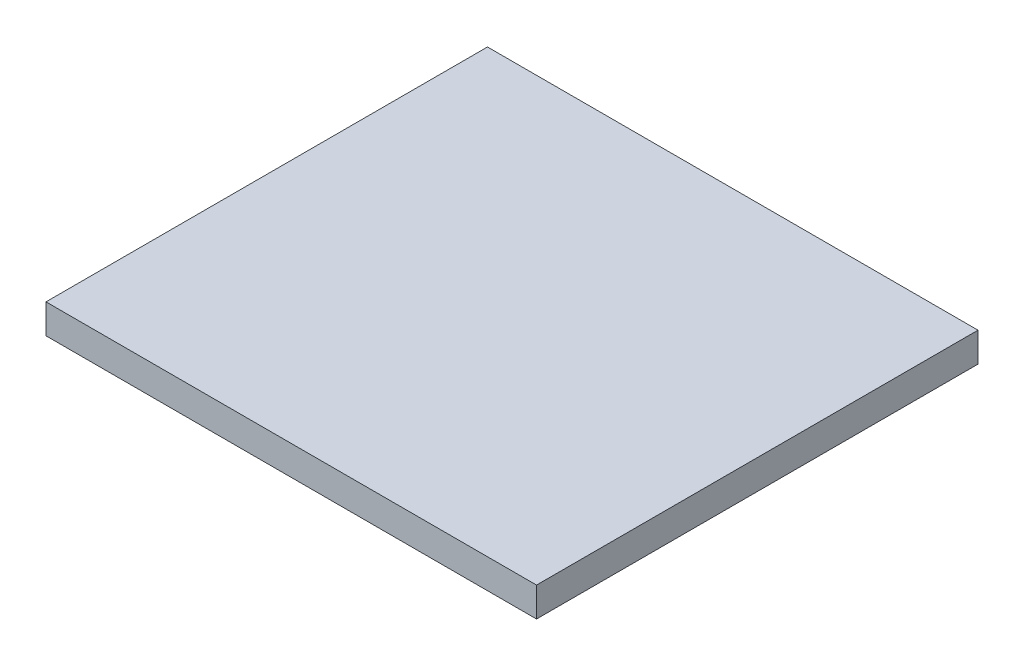
ISO-10303-21;
HEADER;
FILE_DESCRIPTION(('STEP AP214'),'2;1');
FILE_NAME('part.step','',(''),(''),'','','');
FILE_SCHEMA(('AUTOMOTIVE_DESIGN { 1 0 10303 214 1 1 1 1 }'));
ENDSEC;
DATA;
#1=APPLICATION_CONTEXT('core data for automotive mechanical design processes');
#2=APPLICATION_PROTOCOL_DEFINITION('international standard','automotive_design',2000,#1);
#3=PRODUCT_CONTEXT('',#1,'mechanical');
#4=PRODUCT('Part','Part','',(#3));
#5=PRODUCT_RELATED_PRODUCT_CATEGORY('part','',(#4));
#6=PRODUCT_DEFINITION_FORMATION('','',#4);
#7=PRODUCT_DEFINITION_CONTEXT('part definition',#1,'design');
#8=PRODUCT_DEFINITION('design','',#6,#7);
#9=PRODUCT_DEFINITION_SHAPE('','',#8);
#10=(LENGTH_UNIT() NAMED_UNIT(*) SI_UNIT(.MILLI.,.METRE.));
#11=(NAMED_UNIT(*) PLANE_ANGLE_UNIT() SI_UNIT($,.RADIAN.));
#12=(NAMED_UNIT(*) SI_UNIT($,.STERADIAN.) SOLID_ANGLE_UNIT());
#13=UNCERTAINTY_MEASURE_WITH_UNIT(LENGTH_MEASURE(1.E-05),#10,'distance_accuracy_value','');
#14=(GEOMETRIC_REPRESENTATION_CONTEXT(3) GLOBAL_UNCERTAINTY_ASSIGNED_CONTEXT((#13)) GLOBAL_UNIT_ASSIGNED_CONTEXT((#10,
#11,#12)) REPRESENTATION_CONTEXT('',''));
#15=CARTESIAN_POINT('',(0.,0.,0.));
#16=DIRECTION('',(0.,0.,1.));
#17=DIRECTION('',(1.,0.,0.));
#18=AXIS2_PLACEMENT_3D('',#15,#16,#17);
#19=CARTESIAN_POINT('',(0.,300.,0.));
#20=DIRECTION('',(1.,0.,0.));
#21=DIRECTION('',(0.,0.,-1.));
#22=AXIS2_PLACEMENT_3D('',#19,#20,#21);
#23=PLANE('',#22);
#24=DIRECTION('',(0.,0.,1.));
#25=VECTOR('',#24,1.);
#26=CARTESIAN_POINT('',(0.,0.,0.));
#27=LINE('',#26,#25);
#28=CARTESIAN_POINT('',(0.,0.,-4500.));
#29=VERTEX_POINT('',#28);
#30=CARTESIAN_POINT('',(0.,0.,0.));
#31=VERTEX_POINT('',#30);
#32=EDGE_CURVE('E113',#29,#31,#27,.T.);
#33=ORIENTED_EDGE('',*,*,#32,.T.);
#34=DIRECTION('',(0.,-1.,0.));
#35=VECTOR('',#34,1.);
#36=CARTESIAN_POINT('',(0.,300.,0.));
#37=LINE('',#36,#35);
#38=CARTESIAN_POINT('',(0.,300.,0.));
#39=VERTEX_POINT('',#38);
#40=EDGE_CURVE('E11',#39,#31,#37,.T.);
#41=ORIENTED_EDGE('',*,*,#40,.F.);
#42=DIRECTION('',(0.,0.,1.));
#43=VECTOR('',#42,1.);
#44=CARTESIAN_POINT('',(0.,300.,0.));
#45=LINE('',#44,#43);
#46=CARTESIAN_POINT('',(0.,300.,-4500.));
#47=VERTEX_POINT('',#46);
#48=EDGE_CURVE('E97',#47,#39,#45,.T.);
#49=ORIENTED_EDGE('',*,*,#48,.F.);
#50=DIRECTION('',(0.,-1.,0.));
#51=VECTOR('',#50,1.);
#52=CARTESIAN_POINT('',(0.,300.,-4500.));
#53=LINE('',#52,#51);
#54=EDGE_CURVE('E109',#47,#29,#53,.T.);
#55=ORIENTED_EDGE('',*,*,#54,.T.);
#56=EDGE_LOOP('',(#33,#41,#49,#55));
#57=FACE_BOUND('',#56,.T.);
#58=ADVANCED_FACE('F45',(#57),#23,.F.);
#59=CARTESIAN_POINT('',(0.,300.,0.));
#60=DIRECTION('',(0.,0.,-1.));
#61=DIRECTION('',(-1.,0.,0.));
#62=AXIS2_PLACEMENT_3D('',#59,#60,#61);
#63=PLANE('',#62);
#64=DIRECTION('',(1.,0.,0.));
#65=VECTOR('',#64,1.);
#66=CARTESIAN_POINT('',(0.,0.,0.));
#67=LINE('',#66,#65);
#68=CARTESIAN_POINT('',(5000.,0.,0.));
#69=VERTEX_POINT('',#68);
#70=EDGE_CURVE('E102',#31,#69,#67,.T.);
#71=ORIENTED_EDGE('',*,*,#70,.T.);
#72=DIRECTION('',(0.,-1.,0.));
#73=VECTOR('',#72,1.);
#74=CARTESIAN_POINT('',(5000.,300.,0.));
#75=LINE('',#74,#73);
#76=CARTESIAN_POINT('',(5000.,300.,0.));
#77=VERTEX_POINT('',#76);
#78=EDGE_CURVE('E54',#77,#69,#75,.T.);
#79=ORIENTED_EDGE('',*,*,#78,.F.);
#80=DIRECTION('',(1.,0.,0.));
#81=VECTOR('',#80,1.);
#82=CARTESIAN_POINT('',(0.,300.,0.));
#83=LINE('',#82,#81);
#84=EDGE_CURVE('E92',#39,#77,#83,.T.);
#85=ORIENTED_EDGE('',*,*,#84,.F.);
#86=ORIENTED_EDGE('',*,*,#40,.T.);
#87=EDGE_LOOP('',(#71,#79,#85,#86));
#88=FACE_BOUND('',#87,.T.);
#89=ADVANCED_FACE('F101',(#88),#63,.F.);
#90=CARTESIAN_POINT('',(5000.,300.,0.));
#91=DIRECTION('',(-1.,0.,0.));
#92=DIRECTION('',(0.,0.,1.));
#93=AXIS2_PLACEMENT_3D('',#90,#91,#92);
#94=PLANE('',#93);
#95=DIRECTION('',(0.,0.,-1.));
#96=VECTOR('',#95,1.);
#97=CARTESIAN_POINT('',(5000.,0.,0.));
#98=LINE('',#97,#96);
#99=CARTESIAN_POINT('',(5000.,0.,-4500.));
#100=VERTEX_POINT('',#99);
#101=EDGE_CURVE('E79',#69,#100,#98,.T.);
#102=ORIENTED_EDGE('',*,*,#101,.T.);
#103=DIRECTION('',(0.,-1.,0.));
#104=VECTOR('',#103,1.);
#105=CARTESIAN_POINT('',(5000.,300.,-4500.));
#106=LINE('',#105,#104);
#107=CARTESIAN_POINT('',(5000.,300.,-4500.));
#108=VERTEX_POINT('',#107);
#109=EDGE_CURVE('E104',#108,#100,#106,.T.);
#110=ORIENTED_EDGE('',*,*,#109,.F.);
#111=DIRECTION('',(0.,0.,-1.));
#112=VECTOR('',#111,1.);
#113=CARTESIAN_POINT('',(5000.,300.,0.));
#114=LINE('',#113,#112);
#115=EDGE_CURVE('E95',#77,#108,#114,.T.);
#116=ORIENTED_EDGE('',*,*,#115,.F.);
#117=ORIENTED_EDGE('',*,*,#78,.T.);
#118=EDGE_LOOP('',(#102,#110,#116,#117));
#119=FACE_BOUND('',#118,.T.);
#120=ADVANCED_FACE('F105',(#119),#94,.F.);
#121=CARTESIAN_POINT('',(0.,300.,-4500.));
#122=DIRECTION('',(0.,0.,1.));
#123=DIRECTION('',(1.,0.,0.));
#124=AXIS2_PLACEMENT_3D('',#121,#122,#123);
#125=PLANE('',#124);
#126=DIRECTION('',(-1.,0.,0.));
#127=VECTOR('',#126,1.);
#128=CARTESIAN_POINT('',(0.,0.,-4500.));
#129=LINE('',#128,#127);
#130=EDGE_CURVE('E85',#100,#29,#129,.T.);
#131=ORIENTED_EDGE('',*,*,#130,.T.);
#132=ORIENTED_EDGE('',*,*,#54,.F.);
#133=DIRECTION('',(-1.,0.,0.));
#134=VECTOR('',#133,1.);
#135=CARTESIAN_POINT('',(0.,300.,-4500.));
#136=LINE('',#135,#134);
#137=EDGE_CURVE('E62',#108,#47,#136,.T.);
#138=ORIENTED_EDGE('',*,*,#137,.F.);
#139=ORIENTED_EDGE('',*,*,#109,.T.);
#140=EDGE_LOOP('',(#131,#132,#138,#139));
#141=FACE_BOUND('',#140,.T.);
#142=ADVANCED_FACE('F126',(#141),#125,.F.);
#143=CARTESIAN_POINT('',(0.,300.,0.));
#144=DIRECTION('',(0.,-1.,0.));
#145=DIRECTION('',(0.,0.,-1.));
#146=AXIS2_PLACEMENT_3D('',#143,#144,#145);
#147=PLANE('',#146);
#148=ORIENTED_EDGE('',*,*,#48,.T.);
#149=ORIENTED_EDGE('',*,*,#84,.T.);
#150=ORIENTED_EDGE('',*,*,#115,.T.);
#151=ORIENTED_EDGE('',*,*,#137,.T.);
#152=EDGE_LOOP('',(#148,#149,#150,#151));
#153=FACE_BOUND('',#152,.T.);
#154=ADVANCED_FACE('F93',(#153),#147,.F.);
#155=CARTESIAN_POINT('',(0.,0.,0.));
#156=DIRECTION('',(0.,-1.,0.));
#157=DIRECTION('',(0.,0.,-1.));
#158=AXIS2_PLACEMENT_3D('',#155,#156,#157);
#159=PLANE('',#158);
#160=ORIENTED_EDGE('',*,*,#32,.F.);
#161=ORIENTED_EDGE('',*,*,#130,.F.);
#162=ORIENTED_EDGE('',*,*,#101,.F.);
#163=ORIENTED_EDGE('',*,*,#70,.F.);
#164=EDGE_LOOP('',(#160,#161,#162,#163));
#165=FACE_BOUND('',#164,.T.);
#166=ADVANCED_FACE('F129',(#165),#159,.T.);
#167=CLOSED_SHELL('',(#58,#89,#120,#142,#154,#166));
#168=MANIFOLD_SOLID_BREP('B2',#167);
#169=ADVANCED_BREP_SHAPE_REPRESENTATION('',(#18,#168),#14);
#170=SHAPE_DEFINITION_REPRESENTATION(#9,#169);
ENDSEC;
END-ISO-10303-21;
